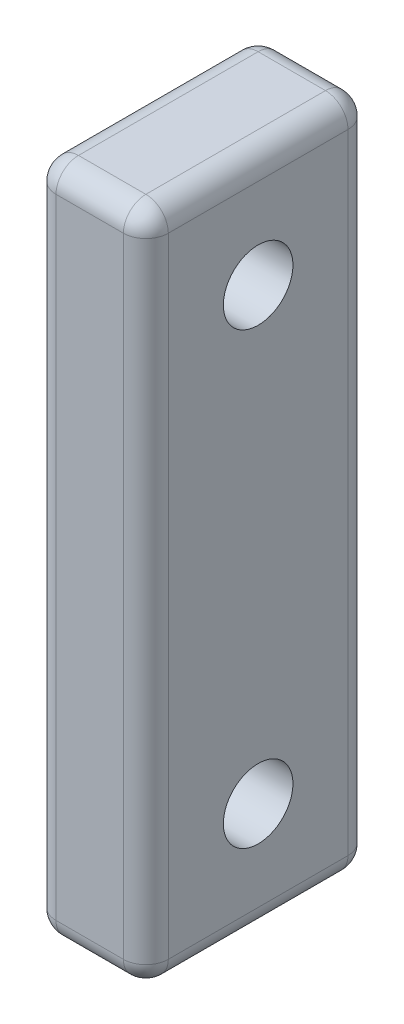
ISO-10303-21;
HEADER;
FILE_DESCRIPTION(('STEP AP214'),'2;1');
FILE_NAME('part.step','',(''),(''),'','','');
FILE_SCHEMA(('AUTOMOTIVE_DESIGN { 1 0 10303 214 1 1 1 1 }'));
ENDSEC;
DATA;
#1=APPLICATION_CONTEXT('core data for automotive mechanical design processes');
#2=APPLICATION_PROTOCOL_DEFINITION('international standard','automotive_design',2000,#1);
#3=PRODUCT_CONTEXT('',#1,'mechanical');
#4=PRODUCT('Part','Part','',(#3));
#5=PRODUCT_RELATED_PRODUCT_CATEGORY('part','',(#4));
#6=PRODUCT_DEFINITION_FORMATION('','',#4);
#7=PRODUCT_DEFINITION_CONTEXT('part definition',#1,'design');
#8=PRODUCT_DEFINITION('design','',#6,#7);
#9=PRODUCT_DEFINITION_SHAPE('','',#8);
#10=(LENGTH_UNIT() NAMED_UNIT(*) SI_UNIT(.MILLI.,.METRE.));
#11=(NAMED_UNIT(*) PLANE_ANGLE_UNIT() SI_UNIT($,.RADIAN.));
#12=(NAMED_UNIT(*) SI_UNIT($,.STERADIAN.) SOLID_ANGLE_UNIT());
#13=UNCERTAINTY_MEASURE_WITH_UNIT(LENGTH_MEASURE(1.E-05),#10,'distance_accuracy_value','');
#14=(GEOMETRIC_REPRESENTATION_CONTEXT(3) GLOBAL_UNCERTAINTY_ASSIGNED_CONTEXT((#13)) GLOBAL_UNIT_ASSIGNED_CONTEXT((#10,
#11,#12)) REPRESENTATION_CONTEXT('',''));
#15=CARTESIAN_POINT('',(0.,0.,0.));
#16=DIRECTION('',(0.,0.,1.));
#17=DIRECTION('',(1.,0.,0.));
#18=AXIS2_PLACEMENT_3D('',#15,#16,#17);
#19=CARTESIAN_POINT('',(6.34999999999999,38.1,25.4));
#20=DIRECTION('',(-1.,0.,0.));
#21=DIRECTION('',(0.,-1.,0.));
#22=AXIS2_PLACEMENT_3D('',#19,#20,#21);
#23=PLANE('',#22);
#24=DIRECTION('',(0.,1.,0.));
#25=VECTOR('',#24,1.);
#26=CARTESIAN_POINT('',(6.35,-38.1,22.86));
#27=LINE('',#26,#25);
#28=CARTESIAN_POINT('',(6.34999999999999,35.56,22.86));
#29=VERTEX_POINT('',#28);
#30=CARTESIAN_POINT('',(6.35,-35.56,22.86));
#31=VERTEX_POINT('',#30);
#32=EDGE_CURVE('E232',#29,#31,#27,.F.);
#33=ORIENTED_EDGE('',*,*,#32,.T.);
#34=DIRECTION('',(0.,0.,-1.));
#35=VECTOR('',#34,1.);
#36=CARTESIAN_POINT('',(6.35,-35.56,25.4));
#37=LINE('',#36,#35);
#38=CARTESIAN_POINT('',(6.35,-35.56,2.54));
#39=VERTEX_POINT('',#38);
#40=EDGE_CURVE('E11',#31,#39,#37,.T.);
#41=ORIENTED_EDGE('',*,*,#40,.T.);
#42=DIRECTION('',(0.,1.,0.));
#43=VECTOR('',#42,1.);
#44=CARTESIAN_POINT('',(6.34999999999999,38.1,2.54));
#45=LINE('',#44,#43);
#46=CARTESIAN_POINT('',(6.34999999999999,35.56,2.54));
#47=VERTEX_POINT('',#46);
#48=EDGE_CURVE('E49',#39,#47,#45,.T.);
#49=ORIENTED_EDGE('',*,*,#48,.T.);
#50=DIRECTION('',(0.,0.,-1.));
#51=VECTOR('',#50,1.);
#52=CARTESIAN_POINT('',(6.34999999999999,35.56,25.4));
#53=LINE('',#52,#51);
#54=EDGE_CURVE('E235',#47,#29,#53,.F.);
#55=ORIENTED_EDGE('',*,*,#54,.T.);
#56=EDGE_LOOP('',(#33,#41,#49,#55));
#57=FACE_BOUND('',#56,.T.);
#58=CARTESIAN_POINT('',(6.34999999999999,25.4,12.7));
#59=DIRECTION('',(1.,0.,0.));
#60=DIRECTION('',(0.,0.,-1.));
#61=AXIS2_PLACEMENT_3D('',#58,#59,#60);
#62=CIRCLE('',#61,3.937);
#63=CARTESIAN_POINT('',(6.34999999999999,25.4,8.763));
#64=VERTEX_POINT('',#63);
#65=EDGE_CURVE('E314',#64,#64,#62,.T.);
#66=ORIENTED_EDGE('',*,*,#65,.F.);
#67=EDGE_LOOP('',(#66));
#68=FACE_BOUND('',#67,.T.);
#69=CARTESIAN_POINT('',(6.35,-25.4,12.7));
#70=DIRECTION('',(1.,0.,0.));
#71=DIRECTION('',(0.,0.,-1.));
#72=AXIS2_PLACEMENT_3D('',#69,#70,#71);
#73=CIRCLE('',#72,3.937);
#74=CARTESIAN_POINT('',(6.35,-25.4,8.763));
#75=VERTEX_POINT('',#74);
#76=EDGE_CURVE('E173',#75,#75,#73,.T.);
#77=ORIENTED_EDGE('',*,*,#76,.F.);
#78=EDGE_LOOP('',(#77));
#79=FACE_BOUND('',#78,.T.);
#80=ADVANCED_FACE('F39',(#57,#68,#79),#23,.F.);
#81=CARTESIAN_POINT('',(-6.35000000000001,38.1,25.4));
#82=DIRECTION('',(0.,-1.,0.));
#83=DIRECTION('',(0.,0.,-1.));
#84=AXIS2_PLACEMENT_3D('',#81,#82,#83);
#85=PLANE('',#84);
#86=DIRECTION('',(0.,0.,-1.));
#87=VECTOR('',#86,1.);
#88=CARTESIAN_POINT('',(3.80999999999999,38.1,25.4));
#89=LINE('',#88,#87);
#90=CARTESIAN_POINT('',(3.80999999999999,38.1,22.86));
#91=VERTEX_POINT('',#90);
#92=CARTESIAN_POINT('',(3.80999999999999,38.1,2.54));
#93=VERTEX_POINT('',#92);
#94=EDGE_CURVE('E133',#91,#93,#89,.T.);
#95=ORIENTED_EDGE('',*,*,#94,.T.);
#96=DIRECTION('',(-1.,0.,0.));
#97=VECTOR('',#96,1.);
#98=CARTESIAN_POINT('',(-6.35000000000001,38.1,2.54));
#99=LINE('',#98,#97);
#100=CARTESIAN_POINT('',(-3.81000000000001,38.1,2.54));
#101=VERTEX_POINT('',#100);
#102=EDGE_CURVE('E179',#93,#101,#99,.T.);
#103=ORIENTED_EDGE('',*,*,#102,.T.);
#104=DIRECTION('',(0.,0.,-1.));
#105=VECTOR('',#104,1.);
#106=CARTESIAN_POINT('',(-3.81000000000001,38.1,25.4));
#107=LINE('',#106,#105);
#108=CARTESIAN_POINT('',(-3.81000000000001,38.1,22.86));
#109=VERTEX_POINT('',#108);
#110=EDGE_CURVE('E136',#101,#109,#107,.F.);
#111=ORIENTED_EDGE('',*,*,#110,.T.);
#112=DIRECTION('',(-1.,0.,0.));
#113=VECTOR('',#112,1.);
#114=CARTESIAN_POINT('',(6.34999999999999,38.1,22.86));
#115=LINE('',#114,#113);
#116=EDGE_CURVE('E128',#109,#91,#115,.F.);
#117=ORIENTED_EDGE('',*,*,#116,.T.);
#118=EDGE_LOOP('',(#95,#103,#111,#117));
#119=FACE_BOUND('',#118,.T.);
#120=ADVANCED_FACE('F130',(#119),#85,.F.);
#121=CARTESIAN_POINT('',(-6.35000000000001,38.1,25.4));
#122=DIRECTION('',(1.,0.,0.));
#123=DIRECTION('',(0.,1.,0.));
#124=AXIS2_PLACEMENT_3D('',#121,#122,#123);
#125=PLANE('',#124);
#126=DIRECTION('',(0.,-1.,0.));
#127=VECTOR('',#126,1.);
#128=CARTESIAN_POINT('',(-6.35000000000001,38.1,22.86));
#129=LINE('',#128,#127);
#130=CARTESIAN_POINT('',(-6.34999999999999,-35.56,22.86));
#131=VERTEX_POINT('',#130);
#132=CARTESIAN_POINT('',(-6.35000000000001,35.56,22.86));
#133=VERTEX_POINT('',#132);
#134=EDGE_CURVE('E201',#131,#133,#129,.F.);
#135=ORIENTED_EDGE('',*,*,#134,.T.);
#136=DIRECTION('',(0.,0.,-1.));
#137=VECTOR('',#136,1.);
#138=CARTESIAN_POINT('',(-6.35000000000001,35.56,25.4));
#139=LINE('',#138,#137);
#140=CARTESIAN_POINT('',(-6.35000000000001,35.56,2.54));
#141=VERTEX_POINT('',#140);
#142=EDGE_CURVE('E204',#133,#141,#139,.T.);
#143=ORIENTED_EDGE('',*,*,#142,.T.);
#144=DIRECTION('',(0.,-1.,0.));
#145=VECTOR('',#144,1.);
#146=CARTESIAN_POINT('',(-6.35000000000001,38.1,2.54));
#147=LINE('',#146,#145);
#148=CARTESIAN_POINT('',(-6.34999999999999,-35.56,2.54));
#149=VERTEX_POINT('',#148);
#150=EDGE_CURVE('E198',#141,#149,#147,.T.);
#151=ORIENTED_EDGE('',*,*,#150,.T.);
#152=DIRECTION('',(0.,0.,-1.));
#153=VECTOR('',#152,1.);
#154=CARTESIAN_POINT('',(-6.34999999999999,-35.56,25.4));
#155=LINE('',#154,#153);
#156=EDGE_CURVE('E195',#149,#131,#155,.F.);
#157=ORIENTED_EDGE('',*,*,#156,.T.);
#158=EDGE_LOOP('',(#135,#143,#151,#157));
#159=FACE_BOUND('',#158,.T.);
#160=CARTESIAN_POINT('',(-6.35000000000002,25.4,12.7));
#161=DIRECTION('',(1.,0.,0.));
#162=DIRECTION('',(0.,0.,-1.));
#163=AXIS2_PLACEMENT_3D('',#160,#161,#162);
#164=CIRCLE('',#163,3.937);
#165=CARTESIAN_POINT('',(-6.35000000000002,25.4,8.763));
#166=VERTEX_POINT('',#165);
#167=EDGE_CURVE('E321',#166,#166,#164,.T.);
#168=ORIENTED_EDGE('',*,*,#167,.T.);
#169=EDGE_LOOP('',(#168));
#170=FACE_BOUND('',#169,.T.);
#171=CARTESIAN_POINT('',(-6.35000000000001,-25.4,12.7));
#172=DIRECTION('',(1.,0.,0.));
#173=DIRECTION('',(0.,0.,-1.));
#174=AXIS2_PLACEMENT_3D('',#171,#172,#173);
#175=CIRCLE('',#174,3.937);
#176=CARTESIAN_POINT('',(-6.35000000000001,-25.4,8.763));
#177=VERTEX_POINT('',#176);
#178=EDGE_CURVE('E169',#177,#177,#175,.T.);
#179=ORIENTED_EDGE('',*,*,#178,.T.);
#180=EDGE_LOOP('',(#179));
#181=FACE_BOUND('',#180,.T.);
#182=ADVANCED_FACE('F339',(#159,#170,#181),#125,.F.);
#183=CARTESIAN_POINT('',(-6.34999999999999,-38.1,25.4));
#184=DIRECTION('',(0.,1.,0.));
#185=DIRECTION('',(0.,0.,1.));
#186=AXIS2_PLACEMENT_3D('',#183,#184,#185);
#187=PLANE('',#186);
#188=DIRECTION('',(1.,0.,0.));
#189=VECTOR('',#188,1.);
#190=CARTESIAN_POINT('',(-6.34999999999999,-38.1,2.54));
#191=LINE('',#190,#189);
#192=CARTESIAN_POINT('',(-3.80999999999999,-38.1,2.54));
#193=VERTEX_POINT('',#192);
#194=CARTESIAN_POINT('',(3.81,-38.1,2.54));
#195=VERTEX_POINT('',#194);
#196=EDGE_CURVE('E225',#193,#195,#191,.T.);
#197=ORIENTED_EDGE('',*,*,#196,.T.);
#198=DIRECTION('',(0.,0.,-1.));
#199=VECTOR('',#198,1.);
#200=CARTESIAN_POINT('',(3.81,-38.1,25.4));
#201=LINE('',#200,#199);
#202=CARTESIAN_POINT('',(3.81,-38.1,22.86));
#203=VERTEX_POINT('',#202);
#204=EDGE_CURVE('E229',#195,#203,#201,.F.);
#205=ORIENTED_EDGE('',*,*,#204,.T.);
#206=DIRECTION('',(1.,0.,0.));
#207=VECTOR('',#206,1.);
#208=CARTESIAN_POINT('',(-6.34999999999999,-38.1,22.86));
#209=LINE('',#208,#207);
#210=CARTESIAN_POINT('',(-3.80999999999999,-38.1,22.86));
#211=VERTEX_POINT('',#210);
#212=EDGE_CURVE('E222',#203,#211,#209,.F.);
#213=ORIENTED_EDGE('',*,*,#212,.T.);
#214=DIRECTION('',(0.,0.,-1.));
#215=VECTOR('',#214,1.);
#216=CARTESIAN_POINT('',(-3.80999999999999,-38.1,25.4));
#217=LINE('',#216,#215);
#218=EDGE_CURVE('E219',#211,#193,#217,.T.);
#219=ORIENTED_EDGE('',*,*,#218,.T.);
#220=EDGE_LOOP('',(#197,#205,#213,#219));
#221=FACE_BOUND('',#220,.T.);
#222=ADVANCED_FACE('F423',(#221),#187,.F.);
#223=CARTESIAN_POINT('',(0.,0.,25.4));
#224=DIRECTION('',(0.,0.,1.));
#225=DIRECTION('',(1.,0.,0.));
#226=AXIS2_PLACEMENT_3D('',#223,#224,#225);
#227=PLANE('',#226);
#228=DIRECTION('',(0.,1.,0.));
#229=VECTOR('',#228,1.);
#230=CARTESIAN_POINT('',(3.80999999999999,38.1,25.4));
#231=LINE('',#230,#229);
#232=CARTESIAN_POINT('',(3.81,-35.56,25.4));
#233=VERTEX_POINT('',#232);
#234=CARTESIAN_POINT('',(3.80999999999999,35.56,25.4));
#235=VERTEX_POINT('',#234);
#236=EDGE_CURVE('E208',#233,#235,#231,.T.);
#237=ORIENTED_EDGE('',*,*,#236,.T.);
#238=DIRECTION('',(-1.,0.,0.));
#239=VECTOR('',#238,1.);
#240=CARTESIAN_POINT('',(-6.35000000000001,35.56,25.4));
#241=LINE('',#240,#239);
#242=CARTESIAN_POINT('',(-3.81000000000001,35.56,25.4));
#243=VERTEX_POINT('',#242);
#244=EDGE_CURVE('E148',#235,#243,#241,.T.);
#245=ORIENTED_EDGE('',*,*,#244,.T.);
#246=DIRECTION('',(0.,-1.,0.));
#247=VECTOR('',#246,1.);
#248=CARTESIAN_POINT('',(-3.80999999999999,-38.1,25.4));
#249=LINE('',#248,#247);
#250=CARTESIAN_POINT('',(-3.80999999999999,-35.56,25.4));
#251=VERTEX_POINT('',#250);
#252=EDGE_CURVE('E214',#243,#251,#249,.T.);
#253=ORIENTED_EDGE('',*,*,#252,.T.);
#254=DIRECTION('',(1.,0.,0.));
#255=VECTOR('',#254,1.);
#256=CARTESIAN_POINT('',(6.35,-35.56,25.4));
#257=LINE('',#256,#255);
#258=EDGE_CURVE('E211',#251,#233,#257,.T.);
#259=ORIENTED_EDGE('',*,*,#258,.T.);
#260=EDGE_LOOP('',(#237,#245,#253,#259));
#261=FACE_BOUND('',#260,.T.);
#262=ADVANCED_FACE('F418',(#261),#227,.T.);
#263=CARTESIAN_POINT('',(0.,0.,0.));
#264=DIRECTION('',(0.,0.,1.));
#265=DIRECTION('',(1.,0.,0.));
#266=AXIS2_PLACEMENT_3D('',#263,#264,#265);
#267=PLANE('',#266);
#268=DIRECTION('',(0.,-1.,0.));
#269=VECTOR('',#268,1.);
#270=CARTESIAN_POINT('',(-3.81,0.,0.));
#271=LINE('',#270,#269);
#272=CARTESIAN_POINT('',(-3.80999999999999,-35.56,0.));
#273=VERTEX_POINT('',#272);
#274=CARTESIAN_POINT('',(-3.81000000000001,35.56,0.));
#275=VERTEX_POINT('',#274);
#276=EDGE_CURVE('E188',#273,#275,#271,.F.);
#277=ORIENTED_EDGE('',*,*,#276,.T.);
#278=DIRECTION('',(-1.,0.,0.));
#279=VECTOR('',#278,1.);
#280=CARTESIAN_POINT('',(0.,35.56,0.));
#281=LINE('',#280,#279);
#282=CARTESIAN_POINT('',(3.80999999999999,35.56,0.));
#283=VERTEX_POINT('',#282);
#284=EDGE_CURVE('E191',#275,#283,#281,.F.);
#285=ORIENTED_EDGE('',*,*,#284,.T.);
#286=DIRECTION('',(0.,1.,0.));
#287=VECTOR('',#286,1.);
#288=CARTESIAN_POINT('',(3.81,0.,0.));
#289=LINE('',#288,#287);
#290=CARTESIAN_POINT('',(3.81,-35.56,0.));
#291=VERTEX_POINT('',#290);
#292=EDGE_CURVE('E182',#283,#291,#289,.F.);
#293=ORIENTED_EDGE('',*,*,#292,.T.);
#294=DIRECTION('',(1.,0.,0.));
#295=VECTOR('',#294,1.);
#296=CARTESIAN_POINT('',(0.,-35.56,0.));
#297=LINE('',#296,#295);
#298=EDGE_CURVE('E185',#291,#273,#297,.F.);
#299=ORIENTED_EDGE('',*,*,#298,.T.);
#300=EDGE_LOOP('',(#277,#285,#293,#299));
#301=FACE_BOUND('',#300,.T.);
#302=ADVANCED_FACE('F447',(#301),#267,.F.);
#303=CARTESIAN_POINT('',(6.35,-25.4,12.7));
#304=DIRECTION('',(1.,0.,0.));
#305=DIRECTION('',(0.,0.,-1.));
#306=AXIS2_PLACEMENT_3D('',#303,#304,#305);
#307=CYLINDRICAL_SURFACE('',#306,3.937);
#308=ORIENTED_EDGE('',*,*,#178,.F.);
#309=EDGE_LOOP('',(#308));
#310=FACE_BOUND('',#309,.T.);
#311=ORIENTED_EDGE('',*,*,#76,.T.);
#312=EDGE_LOOP('',(#311));
#313=FACE_BOUND('',#312,.T.);
#314=ADVANCED_FACE('F332',(#310,#313),#307,.F.);
#315=CARTESIAN_POINT('',(6.34999999999999,25.4,12.7));
#316=DIRECTION('',(1.,0.,0.));
#317=DIRECTION('',(0.,0.,-1.));
#318=AXIS2_PLACEMENT_3D('',#315,#316,#317);
#319=CYLINDRICAL_SURFACE('',#318,3.937);
#320=ORIENTED_EDGE('',*,*,#167,.F.);
#321=EDGE_LOOP('',(#320));
#322=FACE_BOUND('',#321,.T.);
#323=ORIENTED_EDGE('',*,*,#65,.T.);
#324=EDGE_LOOP('',(#323));
#325=FACE_BOUND('',#324,.T.);
#326=ADVANCED_FACE('F412',(#322,#325),#319,.F.);
#327=CARTESIAN_POINT('',(0.,-35.56,22.86));
#328=DIRECTION('',(-1.,0.,0.));
#329=DIRECTION('',(0.,0.,1.));
#330=AXIS2_PLACEMENT_3D('',#327,#328,#329);
#331=CYLINDRICAL_SURFACE('',#330,2.54);
#332=CARTESIAN_POINT('',(3.81,-35.56,22.86));
#333=DIRECTION('',(1.,0.,0.));
#334=DIRECTION('',(0.,0.,-1.));
#335=AXIS2_PLACEMENT_3D('',#332,#333,#334);
#336=CIRCLE('',#335,2.54);
#337=EDGE_CURVE('E43',#233,#203,#336,.T.);
#338=ORIENTED_EDGE('',*,*,#337,.F.);
#339=ORIENTED_EDGE('',*,*,#258,.F.);
#340=CARTESIAN_POINT('',(-3.80999999999999,-35.56,22.86));
#341=DIRECTION('',(-1.,0.,0.));
#342=DIRECTION('',(0.,0.,1.));
#343=AXIS2_PLACEMENT_3D('',#340,#341,#342);
#344=CIRCLE('',#343,2.54);
#345=EDGE_CURVE('E305',#211,#251,#344,.T.);
#346=ORIENTED_EDGE('',*,*,#345,.F.);
#347=ORIENTED_EDGE('',*,*,#212,.F.);
#348=EDGE_LOOP('',(#338,#339,#346,#347));
#349=FACE_BOUND('',#348,.T.);
#350=ADVANCED_FACE('F41',(#349),#331,.T.);
#351=CARTESIAN_POINT('',(3.81,-35.56,22.86));
#352=DIRECTION('',(0.,-1.,0.));
#353=DIRECTION('',(0.,0.,-1.));
#354=AXIS2_PLACEMENT_3D('',#351,#352,#353);
#355=SPHERICAL_SURFACE('',#354,2.54);
#356=CARTESIAN_POINT('',(3.81,-35.56,22.86));
#357=DIRECTION('',(0.,-1.,0.));
#358=DIRECTION('',(0.,0.,-1.));
#359=AXIS2_PLACEMENT_3D('',#356,#357,#358);
#360=CIRCLE('',#359,2.54);
#361=EDGE_CURVE('E298',#233,#31,#360,.F.);
#362=ORIENTED_EDGE('',*,*,#361,.F.);
#363=ORIENTED_EDGE('',*,*,#337,.T.);
#364=CARTESIAN_POINT('',(3.81,-35.56,22.86));
#365=DIRECTION('',(0.,0.,1.));
#366=DIRECTION('',(1.,0.,0.));
#367=AXIS2_PLACEMENT_3D('',#364,#365,#366);
#368=CIRCLE('',#367,2.54);
#369=EDGE_CURVE('E302',#31,#203,#368,.F.);
#370=ORIENTED_EDGE('',*,*,#369,.F.);
#371=EDGE_LOOP('',(#362,#363,#370));
#372=FACE_BOUND('',#371,.T.);
#373=ADVANCED_FACE('F407',(#372),#355,.T.);
#374=CARTESIAN_POINT('',(-3.80999999999999,-35.56,22.86));
#375=DIRECTION('',(0.,0.,1.));
#376=DIRECTION('',(1.,0.,0.));
#377=AXIS2_PLACEMENT_3D('',#374,#375,#376);
#378=SPHERICAL_SURFACE('',#377,2.54);
#379=CARTESIAN_POINT('',(-3.80999999999999,-35.56,22.86));
#380=DIRECTION('',(0.,0.,1.));
#381=DIRECTION('',(1.,0.,0.));
#382=AXIS2_PLACEMENT_3D('',#379,#380,#381);
#383=CIRCLE('',#382,2.54);
#384=EDGE_CURVE('E290',#211,#131,#383,.F.);
#385=ORIENTED_EDGE('',*,*,#384,.F.);
#386=ORIENTED_EDGE('',*,*,#345,.T.);
#387=CARTESIAN_POINT('',(-3.80999999999999,-35.56,22.86));
#388=DIRECTION('',(0.,-1.,0.));
#389=DIRECTION('',(0.,0.,-1.));
#390=AXIS2_PLACEMENT_3D('',#387,#388,#389);
#391=CIRCLE('',#390,2.54);
#392=EDGE_CURVE('E294',#131,#251,#391,.F.);
#393=ORIENTED_EDGE('',*,*,#392,.F.);
#394=EDGE_LOOP('',(#385,#386,#393));
#395=FACE_BOUND('',#394,.T.);
#396=ADVANCED_FACE('F404',(#395),#378,.T.);
#397=CARTESIAN_POINT('',(3.81,-35.56,25.4));
#398=DIRECTION('',(0.,0.,-1.));
#399=DIRECTION('',(-1.,0.,0.));
#400=AXIS2_PLACEMENT_3D('',#397,#398,#399);
#401=CYLINDRICAL_SURFACE('',#400,2.54);
#402=ORIENTED_EDGE('',*,*,#369,.T.);
#403=ORIENTED_EDGE('',*,*,#204,.F.);
#404=CARTESIAN_POINT('',(3.81,-35.56,2.54));
#405=DIRECTION('',(0.,0.,-1.));
#406=DIRECTION('',(-1.,0.,0.));
#407=AXIS2_PLACEMENT_3D('',#404,#405,#406);
#408=CIRCLE('',#407,2.54);
#409=EDGE_CURVE('E283',#39,#195,#408,.T.);
#410=ORIENTED_EDGE('',*,*,#409,.F.);
#411=ORIENTED_EDGE('',*,*,#40,.F.);
#412=EDGE_LOOP('',(#402,#403,#410,#411));
#413=FACE_BOUND('',#412,.T.);
#414=ADVANCED_FACE('F400',(#413),#401,.T.);
#415=CARTESIAN_POINT('',(3.81,0.,22.86));
#416=DIRECTION('',(0.,-1.,0.));
#417=DIRECTION('',(1.,0.,0.));
#418=AXIS2_PLACEMENT_3D('',#415,#416,#417);
#419=CYLINDRICAL_SURFACE('',#418,2.54);
#420=ORIENTED_EDGE('',*,*,#361,.T.);
#421=ORIENTED_EDGE('',*,*,#32,.F.);
#422=CARTESIAN_POINT('',(3.80999999999999,35.56,22.86));
#423=DIRECTION('',(0.,1.,0.));
#424=DIRECTION('',(0.,0.,1.));
#425=AXIS2_PLACEMENT_3D('',#422,#423,#424);
#426=CIRCLE('',#425,2.54);
#427=EDGE_CURVE('E153',#235,#29,#426,.T.);
#428=ORIENTED_EDGE('',*,*,#427,.F.);
#429=ORIENTED_EDGE('',*,*,#236,.F.);
#430=EDGE_LOOP('',(#420,#421,#428,#429));
#431=FACE_BOUND('',#430,.T.);
#432=ADVANCED_FACE('F397',(#431),#419,.T.);
#433=CARTESIAN_POINT('',(0.,35.56,22.86));
#434=DIRECTION('',(1.,0.,0.));
#435=DIRECTION('',(0.,0.,-1.));
#436=AXIS2_PLACEMENT_3D('',#433,#434,#435);
#437=CYLINDRICAL_SURFACE('',#436,2.54);
#438=CARTESIAN_POINT('',(-3.81000000000001,35.56,22.86));
#439=DIRECTION('',(-1.,0.,0.));
#440=DIRECTION('',(0.,0.,1.));
#441=AXIS2_PLACEMENT_3D('',#438,#439,#440);
#442=CIRCLE('',#441,2.54);
#443=EDGE_CURVE('E154',#243,#109,#442,.T.);
#444=ORIENTED_EDGE('',*,*,#443,.F.);
#445=ORIENTED_EDGE('',*,*,#244,.F.);
#446=CARTESIAN_POINT('',(3.80999999999999,35.56,22.86));
#447=DIRECTION('',(1.,0.,0.));
#448=DIRECTION('',(0.,0.,-1.));
#449=AXIS2_PLACEMENT_3D('',#446,#447,#448);
#450=CIRCLE('',#449,2.54);
#451=EDGE_CURVE('E144',#91,#235,#450,.T.);
#452=ORIENTED_EDGE('',*,*,#451,.F.);
#453=ORIENTED_EDGE('',*,*,#116,.F.);
#454=EDGE_LOOP('',(#444,#445,#452,#453));
#455=FACE_BOUND('',#454,.T.);
#456=ADVANCED_FACE('F146',(#455),#437,.T.);
#457=CARTESIAN_POINT('',(-3.81,0.,22.86));
#458=DIRECTION('',(0.,1.,0.));
#459=DIRECTION('',(-1.,0.,0.));
#460=AXIS2_PLACEMENT_3D('',#457,#458,#459);
#461=CYLINDRICAL_SURFACE('',#460,2.54);
#462=ORIENTED_EDGE('',*,*,#392,.T.);
#463=ORIENTED_EDGE('',*,*,#252,.F.);
#464=CARTESIAN_POINT('',(-3.81000000000001,35.56,22.86));
#465=DIRECTION('',(0.,1.,0.));
#466=DIRECTION('',(0.,0.,1.));
#467=AXIS2_PLACEMENT_3D('',#464,#465,#466);
#468=CIRCLE('',#467,2.54);
#469=EDGE_CURVE('E276',#133,#243,#468,.T.);
#470=ORIENTED_EDGE('',*,*,#469,.F.);
#471=ORIENTED_EDGE('',*,*,#134,.F.);
#472=EDGE_LOOP('',(#462,#463,#470,#471));
#473=FACE_BOUND('',#472,.T.);
#474=ADVANCED_FACE('F390',(#473),#461,.T.);
#475=CARTESIAN_POINT('',(-3.80999999999999,-35.56,25.4));
#476=DIRECTION('',(0.,0.,-1.));
#477=DIRECTION('',(-1.,0.,0.));
#478=AXIS2_PLACEMENT_3D('',#475,#476,#477);
#479=CYLINDRICAL_SURFACE('',#478,2.54);
#480=ORIENTED_EDGE('',*,*,#384,.T.);
#481=ORIENTED_EDGE('',*,*,#156,.F.);
#482=CARTESIAN_POINT('',(-3.80999999999999,-35.56,2.54));
#483=DIRECTION('',(0.,0.,-1.));
#484=DIRECTION('',(-1.,0.,0.));
#485=AXIS2_PLACEMENT_3D('',#482,#483,#484);
#486=CIRCLE('',#485,2.54);
#487=EDGE_CURVE('E272',#193,#149,#486,.T.);
#488=ORIENTED_EDGE('',*,*,#487,.F.);
#489=ORIENTED_EDGE('',*,*,#218,.F.);
#490=EDGE_LOOP('',(#480,#481,#488,#489));
#491=FACE_BOUND('',#490,.T.);
#492=ADVANCED_FACE('F386',(#491),#479,.T.);
#493=CARTESIAN_POINT('',(-6.34999999999999,-35.56,2.54));
#494=DIRECTION('',(1.,0.,0.));
#495=DIRECTION('',(0.,0.,-1.));
#496=AXIS2_PLACEMENT_3D('',#493,#494,#495);
#497=CYLINDRICAL_SURFACE('',#496,2.54);
#498=CARTESIAN_POINT('',(3.81,-35.56,2.54));
#499=DIRECTION('',(1.,0.,0.));
#500=DIRECTION('',(0.,0.,-1.));
#501=AXIS2_PLACEMENT_3D('',#498,#499,#500);
#502=CIRCLE('',#501,2.54);
#503=EDGE_CURVE('E286',#195,#291,#502,.T.);
#504=ORIENTED_EDGE('',*,*,#503,.F.);
#505=ORIENTED_EDGE('',*,*,#196,.F.);
#506=CARTESIAN_POINT('',(-3.80999999999999,-35.56,2.54));
#507=DIRECTION('',(-1.,0.,0.));
#508=DIRECTION('',(0.,0.,1.));
#509=AXIS2_PLACEMENT_3D('',#506,#507,#508);
#510=CIRCLE('',#509,2.54);
#511=EDGE_CURVE('E268',#273,#193,#510,.T.);
#512=ORIENTED_EDGE('',*,*,#511,.F.);
#513=ORIENTED_EDGE('',*,*,#298,.F.);
#514=EDGE_LOOP('',(#504,#505,#512,#513));
#515=FACE_BOUND('',#514,.T.);
#516=ADVANCED_FACE('F382',(#515),#497,.T.);
#517=CARTESIAN_POINT('',(3.81,-35.56,2.54));
#518=DIRECTION('',(0.,-1.,0.));
#519=DIRECTION('',(0.,0.,-1.));
#520=AXIS2_PLACEMENT_3D('',#517,#518,#519);
#521=SPHERICAL_SURFACE('',#520,2.54);
#522=ORIENTED_EDGE('',*,*,#409,.T.);
#523=ORIENTED_EDGE('',*,*,#503,.T.);
#524=CARTESIAN_POINT('',(3.81,-35.56,2.54));
#525=DIRECTION('',(0.,-1.,0.));
#526=DIRECTION('',(0.,0.,-1.));
#527=AXIS2_PLACEMENT_3D('',#524,#525,#526);
#528=CIRCLE('',#527,2.54);
#529=EDGE_CURVE('E161',#39,#291,#528,.F.);
#530=ORIENTED_EDGE('',*,*,#529,.F.);
#531=EDGE_LOOP('',(#522,#523,#530));
#532=FACE_BOUND('',#531,.T.);
#533=ADVANCED_FACE('F379',(#532),#521,.T.);
#534=CARTESIAN_POINT('',(3.80999999999999,35.56,22.86));
#535=DIRECTION('',(0.,0.,1.));
#536=DIRECTION('',(1.,0.,0.));
#537=AXIS2_PLACEMENT_3D('',#534,#535,#536);
#538=SPHERICAL_SURFACE('',#537,2.54);
#539=ORIENTED_EDGE('',*,*,#451,.T.);
#540=ORIENTED_EDGE('',*,*,#427,.T.);
#541=CARTESIAN_POINT('',(3.80999999999999,35.56,22.86));
#542=DIRECTION('',(0.,0.,1.));
#543=DIRECTION('',(1.,0.,0.));
#544=AXIS2_PLACEMENT_3D('',#541,#542,#543);
#545=CIRCLE('',#544,2.54);
#546=EDGE_CURVE('E157',#91,#29,#545,.F.);
#547=ORIENTED_EDGE('',*,*,#546,.F.);
#548=EDGE_LOOP('',(#539,#540,#547));
#549=FACE_BOUND('',#548,.T.);
#550=ADVANCED_FACE('F158',(#549),#538,.T.);
#551=CARTESIAN_POINT('',(-3.81000000000001,35.56,22.86));
#552=DIRECTION('',(0.,0.,1.));
#553=DIRECTION('',(1.,0.,0.));
#554=AXIS2_PLACEMENT_3D('',#551,#552,#553);
#555=SPHERICAL_SURFACE('',#554,2.54);
#556=ORIENTED_EDGE('',*,*,#469,.T.);
#557=ORIENTED_EDGE('',*,*,#443,.T.);
#558=CARTESIAN_POINT('',(-3.81000000000001,35.56,22.86));
#559=DIRECTION('',(0.,0.,1.));
#560=DIRECTION('',(1.,0.,0.));
#561=AXIS2_PLACEMENT_3D('',#558,#559,#560);
#562=CIRCLE('',#561,2.54);
#563=EDGE_CURVE('E162',#133,#109,#562,.F.);
#564=ORIENTED_EDGE('',*,*,#563,.F.);
#565=EDGE_LOOP('',(#556,#557,#564));
#566=FACE_BOUND('',#565,.T.);
#567=ADVANCED_FACE('F372',(#566),#555,.T.);
#568=CARTESIAN_POINT('',(-3.80999999999999,-35.56,2.54));
#569=DIRECTION('',(0.,-1.,0.));
#570=DIRECTION('',(0.,0.,-1.));
#571=AXIS2_PLACEMENT_3D('',#568,#569,#570);
#572=SPHERICAL_SURFACE('',#571,2.54);
#573=ORIENTED_EDGE('',*,*,#511,.T.);
#574=ORIENTED_EDGE('',*,*,#487,.T.);
#575=CARTESIAN_POINT('',(-3.80999999999999,-35.56,2.54));
#576=DIRECTION('',(0.,-1.,0.));
#577=DIRECTION('',(0.,0.,-1.));
#578=AXIS2_PLACEMENT_3D('',#575,#576,#577);
#579=CIRCLE('',#578,2.54);
#580=EDGE_CURVE('E259',#273,#149,#579,.F.);
#581=ORIENTED_EDGE('',*,*,#580,.F.);
#582=EDGE_LOOP('',(#573,#574,#581));
#583=FACE_BOUND('',#582,.T.);
#584=ADVANCED_FACE('F369',(#583),#572,.T.);
#585=CARTESIAN_POINT('',(3.80999999999999,38.1,2.54));
#586=DIRECTION('',(0.,1.,0.));
#587=DIRECTION('',(-1.,0.,0.));
#588=AXIS2_PLACEMENT_3D('',#585,#586,#587);
#589=CYLINDRICAL_SURFACE('',#588,2.54);
#590=ORIENTED_EDGE('',*,*,#529,.T.);
#591=ORIENTED_EDGE('',*,*,#292,.F.);
#592=CARTESIAN_POINT('',(3.80999999999999,35.56,2.54));
#593=DIRECTION('',(0.,1.,0.));
#594=DIRECTION('',(0.,0.,1.));
#595=AXIS2_PLACEMENT_3D('',#592,#593,#594);
#596=CIRCLE('',#595,2.54);
#597=EDGE_CURVE('E255',#47,#283,#596,.T.);
#598=ORIENTED_EDGE('',*,*,#597,.F.);
#599=ORIENTED_EDGE('',*,*,#48,.F.);
#600=EDGE_LOOP('',(#590,#591,#598,#599));
#601=FACE_BOUND('',#600,.T.);
#602=ADVANCED_FACE('F366',(#601),#589,.T.);
#603=CARTESIAN_POINT('',(3.80999999999999,35.56,25.4));
#604=DIRECTION('',(0.,0.,-1.));
#605=DIRECTION('',(-1.,0.,0.));
#606=AXIS2_PLACEMENT_3D('',#603,#604,#605);
#607=CYLINDRICAL_SURFACE('',#606,2.54);
#608=ORIENTED_EDGE('',*,*,#546,.T.);
#609=ORIENTED_EDGE('',*,*,#54,.F.);
#610=CARTESIAN_POINT('',(3.80999999999999,35.56,2.54));
#611=DIRECTION('',(0.,0.,-1.));
#612=DIRECTION('',(-1.,0.,0.));
#613=AXIS2_PLACEMENT_3D('',#610,#611,#612);
#614=CIRCLE('',#613,2.54);
#615=EDGE_CURVE('E166',#93,#47,#614,.T.);
#616=ORIENTED_EDGE('',*,*,#615,.F.);
#617=ORIENTED_EDGE('',*,*,#94,.F.);
#618=EDGE_LOOP('',(#608,#609,#616,#617));
#619=FACE_BOUND('',#618,.T.);
#620=ADVANCED_FACE('F164',(#619),#607,.T.);
#621=CARTESIAN_POINT('',(-3.81000000000001,35.56,25.4));
#622=DIRECTION('',(0.,0.,-1.));
#623=DIRECTION('',(-1.,0.,0.));
#624=AXIS2_PLACEMENT_3D('',#621,#622,#623);
#625=CYLINDRICAL_SURFACE('',#624,2.54);
#626=ORIENTED_EDGE('',*,*,#563,.T.);
#627=ORIENTED_EDGE('',*,*,#110,.F.);
#628=CARTESIAN_POINT('',(-3.81000000000001,35.56,2.54));
#629=DIRECTION('',(0.,0.,-1.));
#630=DIRECTION('',(-1.,0.,0.));
#631=AXIS2_PLACEMENT_3D('',#628,#629,#630);
#632=CIRCLE('',#631,2.54);
#633=EDGE_CURVE('E249',#141,#101,#632,.T.);
#634=ORIENTED_EDGE('',*,*,#633,.F.);
#635=ORIENTED_EDGE('',*,*,#142,.F.);
#636=EDGE_LOOP('',(#626,#627,#634,#635));
#637=FACE_BOUND('',#636,.T.);
#638=ADVANCED_FACE('F359',(#637),#625,.T.);
#639=CARTESIAN_POINT('',(-3.81000000000001,38.1,2.54));
#640=DIRECTION('',(0.,-1.,0.));
#641=DIRECTION('',(1.,0.,0.));
#642=AXIS2_PLACEMENT_3D('',#639,#640,#641);
#643=CYLINDRICAL_SURFACE('',#642,2.54);
#644=ORIENTED_EDGE('',*,*,#580,.T.);
#645=ORIENTED_EDGE('',*,*,#150,.F.);
#646=CARTESIAN_POINT('',(-3.81000000000001,35.56,2.54));
#647=DIRECTION('',(0.,1.,0.));
#648=DIRECTION('',(0.,0.,1.));
#649=AXIS2_PLACEMENT_3D('',#646,#647,#648);
#650=CIRCLE('',#649,2.54);
#651=EDGE_CURVE('E246',#275,#141,#650,.T.);
#652=ORIENTED_EDGE('',*,*,#651,.F.);
#653=ORIENTED_EDGE('',*,*,#276,.F.);
#654=EDGE_LOOP('',(#644,#645,#652,#653));
#655=FACE_BOUND('',#654,.T.);
#656=ADVANCED_FACE('F355',(#655),#643,.T.);
#657=CARTESIAN_POINT('',(3.80999999999999,35.56,2.54));
#658=DIRECTION('',(1.,0.,0.));
#659=DIRECTION('',(0.,0.,-1.));
#660=AXIS2_PLACEMENT_3D('',#657,#658,#659);
#661=SPHERICAL_SURFACE('',#660,2.54);
#662=ORIENTED_EDGE('',*,*,#615,.T.);
#663=ORIENTED_EDGE('',*,*,#597,.T.);
#664=CARTESIAN_POINT('',(3.80999999999999,35.56,2.54));
#665=DIRECTION('',(1.,0.,0.));
#666=DIRECTION('',(0.,1.,0.));
#667=AXIS2_PLACEMENT_3D('',#664,#665,#666);
#668=CIRCLE('',#667,2.54);
#669=EDGE_CURVE('E243',#93,#283,#668,.F.);
#670=ORIENTED_EDGE('',*,*,#669,.F.);
#671=EDGE_LOOP('',(#662,#663,#670));
#672=FACE_BOUND('',#671,.T.);
#673=ADVANCED_FACE('F351',(#672),#661,.T.);
#674=CARTESIAN_POINT('',(-3.81000000000001,35.56,2.54));
#675=DIRECTION('',(-1.,0.,0.));
#676=DIRECTION('',(0.,0.,1.));
#677=AXIS2_PLACEMENT_3D('',#674,#675,#676);
#678=SPHERICAL_SURFACE('',#677,2.54);
#679=ORIENTED_EDGE('',*,*,#651,.T.);
#680=ORIENTED_EDGE('',*,*,#633,.T.);
#681=CARTESIAN_POINT('',(-3.81000000000001,35.56,2.54));
#682=DIRECTION('',(-1.,0.,0.));
#683=DIRECTION('',(0.,0.,1.));
#684=AXIS2_PLACEMENT_3D('',#681,#682,#683);
#685=CIRCLE('',#684,2.54);
#686=EDGE_CURVE('E240',#275,#101,#685,.F.);
#687=ORIENTED_EDGE('',*,*,#686,.F.);
#688=EDGE_LOOP('',(#679,#680,#687));
#689=FACE_BOUND('',#688,.T.);
#690=ADVANCED_FACE('F347',(#689),#678,.T.);
#691=CARTESIAN_POINT('',(-6.35000000000001,35.56,2.54));
#692=DIRECTION('',(-1.,0.,0.));
#693=DIRECTION('',(0.,0.,1.));
#694=AXIS2_PLACEMENT_3D('',#691,#692,#693);
#695=CYLINDRICAL_SURFACE('',#694,2.54);
#696=ORIENTED_EDGE('',*,*,#669,.T.);
#697=ORIENTED_EDGE('',*,*,#284,.F.);
#698=ORIENTED_EDGE('',*,*,#686,.T.);
#699=ORIENTED_EDGE('',*,*,#102,.F.);
#700=EDGE_LOOP('',(#696,#697,#698,#699));
#701=FACE_BOUND('',#700,.T.);
#702=ADVANCED_FACE('F344',(#701),#695,.T.);
#703=CLOSED_SHELL('',(#80,#120,#182,#222,#262,#302,#314,#326,#350,#373,#396,#414,#432,#456,#474,
#492,#516,#533,#550,#567,#584,#602,#620,#638,#656,#673,#690,#702));
#704=MANIFOLD_SOLID_BREP('B2',#703);
#705=ADVANCED_BREP_SHAPE_REPRESENTATION('',(#18,#704),#14);
#706=SHAPE_DEFINITION_REPRESENTATION(#9,#705);
ENDSEC;
END-ISO-10303-21;
